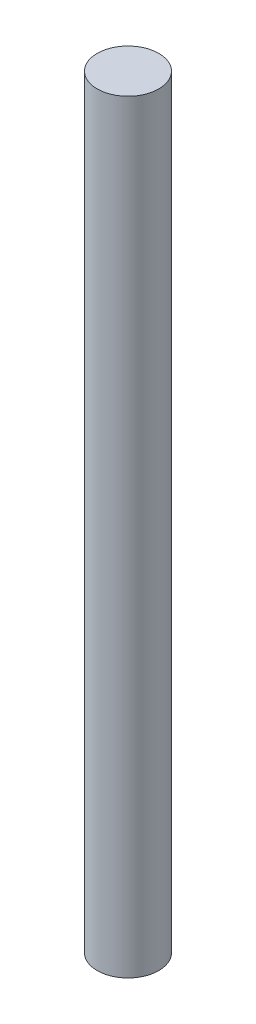
ISO-10303-21;
HEADER;
FILE_DESCRIPTION(('STEP AP214'),'2;1');
FILE_NAME('part.step','',(''),(''),'','','');
FILE_SCHEMA(('AUTOMOTIVE_DESIGN { 1 0 10303 214 1 1 1 1 }'));
ENDSEC;
DATA;
#1=APPLICATION_CONTEXT('core data for automotive mechanical design processes');
#2=APPLICATION_PROTOCOL_DEFINITION('international standard','automotive_design',2000,#1);
#3=PRODUCT_CONTEXT('',#1,'mechanical');
#4=PRODUCT('Part','Part','',(#3));
#5=PRODUCT_RELATED_PRODUCT_CATEGORY('part','',(#4));
#6=PRODUCT_DEFINITION_FORMATION('','',#4);
#7=PRODUCT_DEFINITION_CONTEXT('part definition',#1,'design');
#8=PRODUCT_DEFINITION('design','',#6,#7);
#9=PRODUCT_DEFINITION_SHAPE('','',#8);
#10=(LENGTH_UNIT() NAMED_UNIT(*) SI_UNIT(.MILLI.,.METRE.));
#11=(NAMED_UNIT(*) PLANE_ANGLE_UNIT() SI_UNIT($,.RADIAN.));
#12=(NAMED_UNIT(*) SI_UNIT($,.STERADIAN.) SOLID_ANGLE_UNIT());
#13=UNCERTAINTY_MEASURE_WITH_UNIT(LENGTH_MEASURE(1.E-05),#10,'distance_accuracy_value','');
#14=(GEOMETRIC_REPRESENTATION_CONTEXT(3) GLOBAL_UNCERTAINTY_ASSIGNED_CONTEXT((#13)) GLOBAL_UNIT_ASSIGNED_CONTEXT((#10,
#11,#12)) REPRESENTATION_CONTEXT('',''));
#15=CARTESIAN_POINT('',(0.,0.,0.));
#16=DIRECTION('',(0.,0.,1.));
#17=DIRECTION('',(1.,0.,0.));
#18=AXIS2_PLACEMENT_3D('',#15,#16,#17);
#19=CARTESIAN_POINT('',(0.,72.,0.));
#20=DIRECTION('',(0.,-1.,0.));
#21=DIRECTION('',(0.,0.,-1.));
#22=AXIS2_PLACEMENT_3D('',#19,#20,#21);
#23=CYLINDRICAL_SURFACE('',#22,2.5);
#24=CARTESIAN_POINT('',(0.,0.,0.));
#25=DIRECTION('',(0.,1.,0.));
#26=DIRECTION('',(0.,0.,1.));
#27=AXIS2_PLACEMENT_3D('',#24,#25,#26);
#28=CIRCLE('',#27,2.5);
#29=CARTESIAN_POINT('',(0.,0.,2.5));
#30=VERTEX_POINT('',#29);
#31=EDGE_CURVE('E10',#30,#30,#28,.T.);
#32=ORIENTED_EDGE('',*,*,#31,.T.);
#33=EDGE_LOOP('',(#32));
#34=FACE_BOUND('',#33,.T.);
#35=CARTESIAN_POINT('',(0.,62.,0.));
#36=DIRECTION('',(0.,1.,0.));
#37=DIRECTION('',(0.,0.,1.));
#38=AXIS2_PLACEMENT_3D('',#35,#36,#37);
#39=CIRCLE('',#38,2.5);
#40=CARTESIAN_POINT('',(0.,62.,2.5));
#41=VERTEX_POINT('',#40);
#42=EDGE_CURVE('E39',#41,#41,#39,.T.);
#43=ORIENTED_EDGE('',*,*,#42,.F.);
#44=EDGE_LOOP('',(#43));
#45=FACE_BOUND('',#44,.T.);
#46=ADVANCED_FACE('F33',(#34,#45),#23,.T.);
#47=CARTESIAN_POINT('',(0.,0.,0.));
#48=DIRECTION('',(0.,1.,0.));
#49=DIRECTION('',(0.,0.,1.));
#50=AXIS2_PLACEMENT_3D('',#47,#48,#49);
#51=PLANE('',#50);
#52=ORIENTED_EDGE('',*,*,#31,.F.);
#53=EDGE_LOOP('',(#52));
#54=FACE_BOUND('',#53,.T.);
#55=ADVANCED_FACE('F48',(#54),#51,.F.);
#56=CARTESIAN_POINT('',(0.,62.,0.));
#57=DIRECTION('',(0.,1.,0.));
#58=DIRECTION('',(0.,0.,1.));
#59=AXIS2_PLACEMENT_3D('',#56,#57,#58);
#60=PLANE('',#59);
#61=ORIENTED_EDGE('',*,*,#42,.T.);
#62=EDGE_LOOP('',(#61));
#63=FACE_BOUND('',#62,.T.);
#64=ADVANCED_FACE('F45',(#63),#60,.T.);
#65=CLOSED_SHELL('',(#46,#55,#64));
#66=MANIFOLD_SOLID_BREP('B2',#65);
#67=ADVANCED_BREP_SHAPE_REPRESENTATION('',(#18,#66),#14);
#68=SHAPE_DEFINITION_REPRESENTATION(#9,#67);
ENDSEC;
END-ISO-10303-21;
